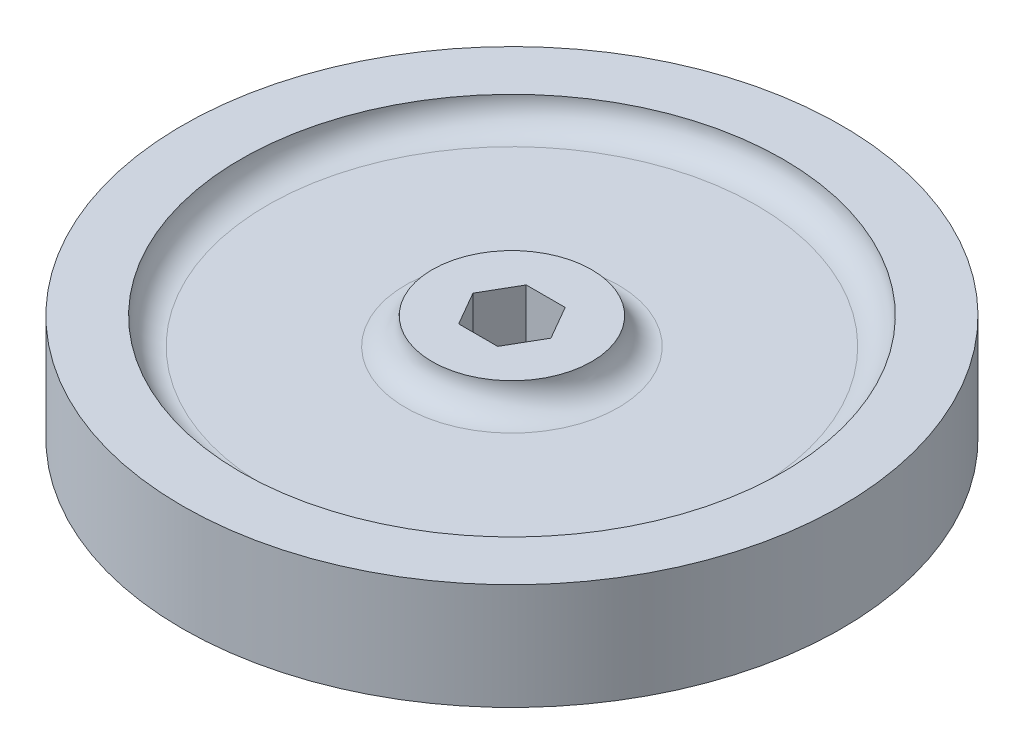
ISO-10303-21;
HEADER;
FILE_DESCRIPTION(('STEP AP214'),'2;1');
FILE_NAME('part.step','',(''),(''),'','','');
FILE_SCHEMA(('AUTOMOTIVE_DESIGN { 1 0 10303 214 1 1 1 1 }'));
ENDSEC;
DATA;
#1=APPLICATION_CONTEXT('core data for automotive mechanical design processes');
#2=APPLICATION_PROTOCOL_DEFINITION('international standard','automotive_design',2000,#1);
#3=PRODUCT_CONTEXT('',#1,'mechanical');
#4=PRODUCT('Part','Part','',(#3));
#5=PRODUCT_RELATED_PRODUCT_CATEGORY('part','',(#4));
#6=PRODUCT_DEFINITION_FORMATION('','',#4);
#7=PRODUCT_DEFINITION_CONTEXT('part definition',#1,'design');
#8=PRODUCT_DEFINITION('design','',#6,#7);
#9=PRODUCT_DEFINITION_SHAPE('','',#8);
#10=(LENGTH_UNIT() NAMED_UNIT(*) SI_UNIT(.MILLI.,.METRE.));
#11=(NAMED_UNIT(*) PLANE_ANGLE_UNIT() SI_UNIT($,.RADIAN.));
#12=(NAMED_UNIT(*) SI_UNIT($,.STERADIAN.) SOLID_ANGLE_UNIT());
#13=UNCERTAINTY_MEASURE_WITH_UNIT(LENGTH_MEASURE(1.E-05),#10,'distance_accuracy_value','');
#14=(GEOMETRIC_REPRESENTATION_CONTEXT(3) GLOBAL_UNCERTAINTY_ASSIGNED_CONTEXT((#13)) GLOBAL_UNIT_ASSIGNED_CONTEXT((#10,
#11,#12)) REPRESENTATION_CONTEXT('',''));
#15=CARTESIAN_POINT('',(0.,0.,0.));
#16=DIRECTION('',(0.,0.,1.));
#17=DIRECTION('',(1.,0.,0.));
#18=AXIS2_PLACEMENT_3D('',#15,#16,#17);
#19=CARTESIAN_POINT('',(0.,20.,0.));
#20=DIRECTION('',(0.,-1.,0.));
#21=DIRECTION('',(0.,0.,1.));
#22=AXIS2_PLACEMENT_3D('',#19,#20,#21);
#23=PLANE('',#22);
#24=DIRECTION('',(1.,0.,0.));
#25=VECTOR('',#24,1.);
#26=CARTESIAN_POINT('',(-3.66617420935411,20.,6.35000000000001));
#27=LINE('',#26,#25);
#28=CARTESIAN_POINT('',(-3.66617420935411,20.,6.35000000000001));
#29=VERTEX_POINT('',#28);
#30=CARTESIAN_POINT('',(3.66617420935416,20.,6.34999999999999));
#31=VERTEX_POINT('',#30);
#32=EDGE_CURVE('E168',#29,#31,#27,.T.);
#33=ORIENTED_EDGE('',*,*,#32,.F.);
#34=DIRECTION('',(0.500000000000001,0.,0.866025403784438));
#35=VECTOR('',#34,1.);
#36=CARTESIAN_POINT('',(-7.33234841870825,20.,0.));
#37=LINE('',#36,#35);
#38=CARTESIAN_POINT('',(-7.33234841870825,20.,0.));
#39=VERTEX_POINT('',#38);
#40=EDGE_CURVE('E152',#39,#29,#37,.T.);
#41=ORIENTED_EDGE('',*,*,#40,.F.);
#42=DIRECTION('',(-0.499999999999995,0.,0.866025403784442));
#43=VECTOR('',#42,1.);
#44=CARTESIAN_POINT('',(-3.6661742093542,20.,-6.34999999999996));
#45=LINE('',#44,#43);
#46=CARTESIAN_POINT('',(-3.6661742093542,20.,-6.34999999999996));
#47=VERTEX_POINT('',#46);
#48=EDGE_CURVE('E159',#47,#39,#45,.T.);
#49=ORIENTED_EDGE('',*,*,#48,.F.);
#50=DIRECTION('',(-1.,0.,0.));
#51=VECTOR('',#50,1.);
#52=CARTESIAN_POINT('',(3.66617420935407,20.,-6.35000000000004));
#53=LINE('',#52,#51);
#54=CARTESIAN_POINT('',(3.66617420935407,20.,-6.35000000000004));
#55=VERTEX_POINT('',#54);
#56=EDGE_CURVE('E163',#55,#47,#53,.T.);
#57=ORIENTED_EDGE('',*,*,#56,.F.);
#58=DIRECTION('',(-0.500000000000007,0.,-0.866025403784434));
#59=VECTOR('',#58,1.);
#60=CARTESIAN_POINT('',(7.33234841870825,20.,0.));
#61=LINE('',#60,#59);
#62=CARTESIAN_POINT('',(7.33234841870825,20.,0.));
#63=VERTEX_POINT('',#62);
#64=EDGE_CURVE('E177',#63,#55,#61,.T.);
#65=ORIENTED_EDGE('',*,*,#64,.F.);
#66=DIRECTION('',(0.499999999999995,0.,-0.866025403784441));
#67=VECTOR('',#66,1.);
#68=CARTESIAN_POINT('',(3.66617420935416,20.,6.34999999999999));
#69=LINE('',#68,#67);
#70=EDGE_CURVE('E180',#31,#63,#69,.T.);
#71=ORIENTED_EDGE('',*,*,#70,.F.);
#72=EDGE_LOOP('',(#33,#41,#49,#57,#65,#71));
#73=FACE_BOUND('',#72,.T.);
#74=CARTESIAN_POINT('',(0.,20.,0.));
#75=DIRECTION('',(0.,1.,0.));
#76=DIRECTION('',(0.,0.,1.));
#77=AXIS2_PLACEMENT_3D('',#74,#75,#76);
#78=CIRCLE('',#77,15.);
#79=CARTESIAN_POINT('',(0.,20.,15.));
#80=VERTEX_POINT('',#79);
#81=EDGE_CURVE('E172',#80,#80,#78,.T.);
#82=ORIENTED_EDGE('',*,*,#81,.T.);
#83=EDGE_LOOP('',(#82));
#84=FACE_BOUND('',#83,.T.);
#85=ADVANCED_FACE('F95',(#73,#84),#23,.F.);
#86=CARTESIAN_POINT('',(0.,0.,0.));
#87=DIRECTION('',(0.,1.,0.));
#88=DIRECTION('',(0.,0.,1.));
#89=AXIS2_PLACEMENT_3D('',#86,#87,#88);
#90=PLANE('',#89);
#91=CARTESIAN_POINT('',(0.,0.,0.));
#92=DIRECTION('',(0.,1.,0.));
#93=DIRECTION('',(0.,0.,1.));
#94=AXIS2_PLACEMENT_3D('',#91,#92,#93);
#95=CIRCLE('',#94,51.);
#96=CARTESIAN_POINT('',(0.,0.,51.));
#97=VERTEX_POINT('',#96);
#98=EDGE_CURVE('E187',#97,#97,#95,.T.);
#99=ORIENTED_EDGE('',*,*,#98,.T.);
#100=EDGE_LOOP('',(#99));
#101=FACE_BOUND('',#100,.T.);
#102=CARTESIAN_POINT('',(0.,0.,0.));
#103=DIRECTION('',(0.,1.,0.));
#104=DIRECTION('',(0.,0.,1.));
#105=AXIS2_PLACEMENT_3D('',#102,#103,#104);
#106=CIRCLE('',#105,62.);
#107=CARTESIAN_POINT('',(0.,0.,62.));
#108=VERTEX_POINT('',#107);
#109=EDGE_CURVE('E262',#108,#108,#106,.T.);
#110=ORIENTED_EDGE('',*,*,#109,.F.);
#111=EDGE_LOOP('',(#110));
#112=FACE_BOUND('',#111,.T.);
#113=ADVANCED_FACE('F235',(#101,#112),#90,.F.);
#114=CARTESIAN_POINT('',(0.,0.,0.));
#115=DIRECTION('',(0.,1.,0.));
#116=DIRECTION('',(0.,0.,1.));
#117=AXIS2_PLACEMENT_3D('',#114,#115,#116);
#118=CIRCLE('',#117,15.);
#119=CARTESIAN_POINT('',(0.,0.,15.));
#120=VERTEX_POINT('',#119);
#121=EDGE_CURVE('E184',#120,#120,#118,.T.);
#122=ORIENTED_EDGE('',*,*,#121,.F.);
#123=EDGE_LOOP('',(#122));
#124=FACE_BOUND('',#123,.T.);
#125=DIRECTION('',(0.500000000000001,0.,0.866025403784438));
#126=VECTOR('',#125,1.);
#127=CARTESIAN_POINT('',(-7.33234841870825,0.,0.));
#128=LINE('',#127,#126);
#129=CARTESIAN_POINT('',(-7.33234841870825,0.,0.));
#130=VERTEX_POINT('',#129);
#131=CARTESIAN_POINT('',(-3.66617420935411,0.,6.35000000000001));
#132=VERTEX_POINT('',#131);
#133=EDGE_CURVE('E110',#130,#132,#128,.T.);
#134=ORIENTED_EDGE('',*,*,#133,.T.);
#135=DIRECTION('',(1.,0.,0.));
#136=VECTOR('',#135,1.);
#137=CARTESIAN_POINT('',(-3.66617420935411,0.,6.35000000000001));
#138=LINE('',#137,#136);
#139=CARTESIAN_POINT('',(3.66617420935416,0.,6.34999999999999));
#140=VERTEX_POINT('',#139);
#141=EDGE_CURVE('E191',#132,#140,#138,.T.);
#142=ORIENTED_EDGE('',*,*,#141,.T.);
#143=DIRECTION('',(0.499999999999995,0.,-0.866025403784441));
#144=VECTOR('',#143,1.);
#145=CARTESIAN_POINT('',(3.66617420935416,0.,6.34999999999999));
#146=LINE('',#145,#144);
#147=CARTESIAN_POINT('',(7.33234841870825,0.,0.));
#148=VERTEX_POINT('',#147);
#149=EDGE_CURVE('E194',#140,#148,#146,.T.);
#150=ORIENTED_EDGE('',*,*,#149,.T.);
#151=DIRECTION('',(-0.500000000000007,0.,-0.866025403784434));
#152=VECTOR('',#151,1.);
#153=CARTESIAN_POINT('',(7.33234841870825,0.,0.));
#154=LINE('',#153,#152);
#155=CARTESIAN_POINT('',(3.66617420935407,0.,-6.35000000000004));
#156=VERTEX_POINT('',#155);
#157=EDGE_CURVE('E197',#148,#156,#154,.T.);
#158=ORIENTED_EDGE('',*,*,#157,.T.);
#159=DIRECTION('',(-1.,0.,0.));
#160=VECTOR('',#159,1.);
#161=CARTESIAN_POINT('',(3.66617420935407,0.,-6.35000000000004));
#162=LINE('',#161,#160);
#163=CARTESIAN_POINT('',(-3.6661742093542,0.,-6.34999999999996));
#164=VERTEX_POINT('',#163);
#165=EDGE_CURVE('E200',#156,#164,#162,.T.);
#166=ORIENTED_EDGE('',*,*,#165,.T.);
#167=DIRECTION('',(-0.499999999999995,0.,0.866025403784442));
#168=VECTOR('',#167,1.);
#169=CARTESIAN_POINT('',(-3.6661742093542,0.,-6.34999999999996));
#170=LINE('',#169,#168);
#171=EDGE_CURVE('E156',#164,#130,#170,.T.);
#172=ORIENTED_EDGE('',*,*,#171,.T.);
#173=EDGE_LOOP('',(#134,#142,#150,#158,#166,#172));
#174=FACE_BOUND('',#173,.T.);
#175=ADVANCED_FACE('F241',(#124,#174),#90,.F.);
#176=CARTESIAN_POINT('',(-7.33234841870825,10.,0.));
#177=DIRECTION('',(0.866025403784438,0.,-0.500000000000001));
#178=DIRECTION('',(-0.500000000000001,0.,-0.866025403784438));
#179=AXIS2_PLACEMENT_3D('',#176,#177,#178);
#180=PLANE('',#179);
#181=ORIENTED_EDGE('',*,*,#133,.F.);
#182=DIRECTION('',(0.,-1.,0.));
#183=VECTOR('',#182,1.);
#184=CARTESIAN_POINT('',(-7.33234841870825,10.,0.));
#185=LINE('',#184,#183);
#186=EDGE_CURVE('E148',#39,#130,#185,.T.);
#187=ORIENTED_EDGE('',*,*,#186,.F.);
#188=ORIENTED_EDGE('',*,*,#40,.T.);
#189=DIRECTION('',(0.,-1.,0.));
#190=VECTOR('',#189,1.);
#191=CARTESIAN_POINT('',(-3.66617420935411,10.,6.35000000000001));
#192=LINE('',#191,#190);
#193=EDGE_CURVE('E211',#29,#132,#192,.T.);
#194=ORIENTED_EDGE('',*,*,#193,.T.);
#195=EDGE_LOOP('',(#181,#187,#188,#194));
#196=FACE_BOUND('',#195,.T.);
#197=ADVANCED_FACE('F150',(#196),#180,.T.);
#198=CARTESIAN_POINT('',(-3.66617420935411,10.,6.35000000000001));
#199=DIRECTION('',(0.,0.,-1.));
#200=DIRECTION('',(-1.,0.,0.));
#201=AXIS2_PLACEMENT_3D('',#198,#199,#200);
#202=PLANE('',#201);
#203=ORIENTED_EDGE('',*,*,#141,.F.);
#204=ORIENTED_EDGE('',*,*,#193,.F.);
#205=ORIENTED_EDGE('',*,*,#32,.T.);
#206=DIRECTION('',(0.,-1.,0.));
#207=VECTOR('',#206,1.);
#208=CARTESIAN_POINT('',(3.66617420935416,10.,6.34999999999999));
#209=LINE('',#208,#207);
#210=EDGE_CURVE('E209',#31,#140,#209,.T.);
#211=ORIENTED_EDGE('',*,*,#210,.T.);
#212=EDGE_LOOP('',(#203,#204,#205,#211));
#213=FACE_BOUND('',#212,.T.);
#214=ADVANCED_FACE('F285',(#213),#202,.T.);
#215=CARTESIAN_POINT('',(3.66617420935416,10.,6.34999999999999));
#216=DIRECTION('',(-0.866025403784442,0.,-0.499999999999995));
#217=DIRECTION('',(-0.499999999999995,0.,0.866025403784442));
#218=AXIS2_PLACEMENT_3D('',#215,#216,#217);
#219=PLANE('',#218);
#220=ORIENTED_EDGE('',*,*,#149,.F.);
#221=ORIENTED_EDGE('',*,*,#210,.F.);
#222=ORIENTED_EDGE('',*,*,#70,.T.);
#223=DIRECTION('',(0.,-1.,0.));
#224=VECTOR('',#223,1.);
#225=CARTESIAN_POINT('',(7.33234841870825,10.,0.));
#226=LINE('',#225,#224);
#227=EDGE_CURVE('E207',#63,#148,#226,.T.);
#228=ORIENTED_EDGE('',*,*,#227,.T.);
#229=EDGE_LOOP('',(#220,#221,#222,#228));
#230=FACE_BOUND('',#229,.T.);
#231=ADVANCED_FACE('F288',(#230),#219,.T.);
#232=CARTESIAN_POINT('',(7.33234841870825,10.,0.));
#233=DIRECTION('',(-0.866025403784435,0.,0.500000000000007));
#234=DIRECTION('',(0.500000000000007,0.,0.866025403784435));
#235=AXIS2_PLACEMENT_3D('',#232,#233,#234);
#236=PLANE('',#235);
#237=ORIENTED_EDGE('',*,*,#157,.F.);
#238=ORIENTED_EDGE('',*,*,#227,.F.);
#239=ORIENTED_EDGE('',*,*,#64,.T.);
#240=DIRECTION('',(0.,-1.,0.));
#241=VECTOR('',#240,1.);
#242=CARTESIAN_POINT('',(3.66617420935407,10.,-6.35000000000004));
#243=LINE('',#242,#241);
#244=EDGE_CURVE('E205',#55,#156,#243,.T.);
#245=ORIENTED_EDGE('',*,*,#244,.T.);
#246=EDGE_LOOP('',(#237,#238,#239,#245));
#247=FACE_BOUND('',#246,.T.);
#248=ADVANCED_FACE('F292',(#247),#236,.T.);
#249=CARTESIAN_POINT('',(3.66617420935407,10.,-6.35000000000004));
#250=DIRECTION('',(0.,0.,1.));
#251=DIRECTION('',(1.,0.,0.));
#252=AXIS2_PLACEMENT_3D('',#249,#250,#251);
#253=PLANE('',#252);
#254=ORIENTED_EDGE('',*,*,#165,.F.);
#255=ORIENTED_EDGE('',*,*,#244,.F.);
#256=ORIENTED_EDGE('',*,*,#56,.T.);
#257=DIRECTION('',(0.,-1.,0.));
#258=VECTOR('',#257,1.);
#259=CARTESIAN_POINT('',(-3.6661742093542,10.,-6.34999999999996));
#260=LINE('',#259,#258);
#261=EDGE_CURVE('E118',#47,#164,#260,.T.);
#262=ORIENTED_EDGE('',*,*,#261,.T.);
#263=EDGE_LOOP('',(#254,#255,#256,#262));
#264=FACE_BOUND('',#263,.T.);
#265=ADVANCED_FACE('F296',(#264),#253,.T.);
#266=CARTESIAN_POINT('',(-3.6661742093542,10.,-6.34999999999996));
#267=DIRECTION('',(0.866025403784442,0.,0.499999999999995));
#268=DIRECTION('',(0.499999999999995,0.,-0.866025403784442));
#269=AXIS2_PLACEMENT_3D('',#266,#267,#268);
#270=PLANE('',#269);
#271=ORIENTED_EDGE('',*,*,#171,.F.);
#272=ORIENTED_EDGE('',*,*,#261,.F.);
#273=ORIENTED_EDGE('',*,*,#48,.T.);
#274=ORIENTED_EDGE('',*,*,#186,.T.);
#275=EDGE_LOOP('',(#271,#272,#273,#274));
#276=FACE_BOUND('',#275,.T.);
#277=ADVANCED_FACE('F160',(#276),#270,.T.);
#278=CARTESIAN_POINT('',(0.,5.,0.));
#279=DIRECTION('',(0.,1.,0.));
#280=DIRECTION('',(0.,0.,1.));
#281=AXIS2_PLACEMENT_3D('',#278,#279,#280);
#282=PLANE('',#281);
#283=CARTESIAN_POINT('',(0.,5.,0.));
#284=DIRECTION('',(0.,1.,0.));
#285=DIRECTION('',(0.,0.,1.));
#286=AXIS2_PLACEMENT_3D('',#283,#284,#285);
#287=CIRCLE('',#286,20.);
#288=CARTESIAN_POINT('',(0.,5.,20.));
#289=VERTEX_POINT('',#288);
#290=EDGE_CURVE('E216',#289,#289,#287,.T.);
#291=ORIENTED_EDGE('',*,*,#290,.T.);
#292=EDGE_LOOP('',(#291));
#293=FACE_BOUND('',#292,.T.);
#294=CARTESIAN_POINT('',(0.,5.,0.));
#295=DIRECTION('',(0.,1.,0.));
#296=DIRECTION('',(0.,0.,1.));
#297=AXIS2_PLACEMENT_3D('',#294,#295,#296);
#298=CIRCLE('',#297,46.);
#299=CARTESIAN_POINT('',(0.,5.,46.));
#300=VERTEX_POINT('',#299);
#301=EDGE_CURVE('E213',#300,#300,#298,.F.);
#302=ORIENTED_EDGE('',*,*,#301,.T.);
#303=EDGE_LOOP('',(#302));
#304=FACE_BOUND('',#303,.T.);
#305=ADVANCED_FACE('F275',(#293,#304),#282,.F.);
#306=CARTESIAN_POINT('',(0.,0.,0.));
#307=DIRECTION('',(0.,1.,0.));
#308=DIRECTION('',(0.,0.,1.));
#309=AXIS2_PLACEMENT_3D('',#306,#307,#308);
#310=TOROIDAL_SURFACE('',#309,20.,5.);
#311=ORIENTED_EDGE('',*,*,#121,.T.);
#312=EDGE_LOOP('',(#311));
#313=FACE_BOUND('',#312,.T.);
#314=ORIENTED_EDGE('',*,*,#290,.F.);
#315=EDGE_LOOP('',(#314));
#316=FACE_BOUND('',#315,.T.);
#317=ADVANCED_FACE('F254',(#313,#316),#310,.F.);
#318=CARTESIAN_POINT('',(0.,0.,0.));
#319=DIRECTION('',(0.,1.,0.));
#320=DIRECTION('',(0.,0.,1.));
#321=AXIS2_PLACEMENT_3D('',#318,#319,#320);
#322=TOROIDAL_SURFACE('',#321,46.,5.);
#323=ORIENTED_EDGE('',*,*,#301,.F.);
#324=EDGE_LOOP('',(#323));
#325=FACE_BOUND('',#324,.T.);
#326=ORIENTED_EDGE('',*,*,#98,.F.);
#327=EDGE_LOOP('',(#326));
#328=FACE_BOUND('',#327,.T.);
#329=ADVANCED_FACE('F247',(#325,#328),#322,.F.);
#330=CARTESIAN_POINT('',(0.,20.,0.));
#331=DIRECTION('',(0.,1.,0.));
#332=DIRECTION('',(0.,0.,1.));
#333=AXIS2_PLACEMENT_3D('',#330,#331,#332);
#334=CIRCLE('',#333,51.);
#335=CARTESIAN_POINT('',(0.,20.,51.));
#336=VERTEX_POINT('',#335);
#337=EDGE_CURVE('E169',#336,#336,#334,.T.);
#338=ORIENTED_EDGE('',*,*,#337,.F.);
#339=EDGE_LOOP('',(#338));
#340=FACE_BOUND('',#339,.T.);
#341=CARTESIAN_POINT('',(0.,20.,0.));
#342=DIRECTION('',(0.,1.,0.));
#343=DIRECTION('',(0.,0.,1.));
#344=AXIS2_PLACEMENT_3D('',#341,#342,#343);
#345=CIRCLE('',#344,62.);
#346=CARTESIAN_POINT('',(0.,20.,62.));
#347=VERTEX_POINT('',#346);
#348=EDGE_CURVE('E261',#347,#347,#345,.T.);
#349=ORIENTED_EDGE('',*,*,#348,.T.);
#350=EDGE_LOOP('',(#349));
#351=FACE_BOUND('',#350,.T.);
#352=ADVANCED_FACE('F237',(#340,#351),#23,.F.);
#353=CARTESIAN_POINT('',(0.,15.,0.));
#354=DIRECTION('',(0.,-1.,0.));
#355=DIRECTION('',(0.,0.,1.));
#356=AXIS2_PLACEMENT_3D('',#353,#354,#355);
#357=PLANE('',#356);
#358=CARTESIAN_POINT('',(0.,15.,0.));
#359=DIRECTION('',(0.,-1.,0.));
#360=DIRECTION('',(0.,0.,-1.));
#361=AXIS2_PLACEMENT_3D('',#358,#359,#360);
#362=CIRCLE('',#361,20.);
#363=CARTESIAN_POINT('',(0.,15.,-20.));
#364=VERTEX_POINT('',#363);
#365=EDGE_CURVE('E12',#364,#364,#362,.T.);
#366=ORIENTED_EDGE('',*,*,#365,.T.);
#367=EDGE_LOOP('',(#366));
#368=FACE_BOUND('',#367,.T.);
#369=CARTESIAN_POINT('',(0.,15.,0.));
#370=DIRECTION('',(0.,-1.,0.));
#371=DIRECTION('',(0.,0.,-1.));
#372=AXIS2_PLACEMENT_3D('',#369,#370,#371);
#373=CIRCLE('',#372,46.);
#374=CARTESIAN_POINT('',(0.,15.,-46.));
#375=VERTEX_POINT('',#374);
#376=EDGE_CURVE('E103',#375,#375,#373,.F.);
#377=ORIENTED_EDGE('',*,*,#376,.T.);
#378=EDGE_LOOP('',(#377));
#379=FACE_BOUND('',#378,.T.);
#380=ADVANCED_FACE('F221',(#368,#379),#357,.F.);
#381=CARTESIAN_POINT('',(0.,20.,0.));
#382=DIRECTION('',(0.,-1.,0.));
#383=DIRECTION('',(0.,0.,-1.));
#384=AXIS2_PLACEMENT_3D('',#381,#382,#383);
#385=TOROIDAL_SURFACE('',#384,20.,5.);
#386=ORIENTED_EDGE('',*,*,#365,.F.);
#387=EDGE_LOOP('',(#386));
#388=FACE_BOUND('',#387,.T.);
#389=ORIENTED_EDGE('',*,*,#81,.F.);
#390=EDGE_LOOP('',(#389));
#391=FACE_BOUND('',#390,.T.);
#392=ADVANCED_FACE('F225',(#388,#391),#385,.F.);
#393=CARTESIAN_POINT('',(0.,20.,0.));
#394=DIRECTION('',(0.,-1.,0.));
#395=DIRECTION('',(0.,0.,-1.));
#396=AXIS2_PLACEMENT_3D('',#393,#394,#395);
#397=TOROIDAL_SURFACE('',#396,46.,5.);
#398=ORIENTED_EDGE('',*,*,#337,.T.);
#399=EDGE_LOOP('',(#398));
#400=FACE_BOUND('',#399,.T.);
#401=ORIENTED_EDGE('',*,*,#376,.F.);
#402=EDGE_LOOP('',(#401));
#403=FACE_BOUND('',#402,.T.);
#404=ADVANCED_FACE('F97',(#400,#403),#397,.F.);
#405=CARTESIAN_POINT('',(0.,20.,0.));
#406=DIRECTION('',(0.,-1.,0.));
#407=DIRECTION('',(0.,0.,-1.));
#408=AXIS2_PLACEMENT_3D('',#405,#406,#407);
#409=CYLINDRICAL_SURFACE('',#408,62.);
#410=ORIENTED_EDGE('',*,*,#348,.F.);
#411=EDGE_LOOP('',(#410));
#412=FACE_BOUND('',#411,.T.);
#413=ORIENTED_EDGE('',*,*,#109,.T.);
#414=EDGE_LOOP('',(#413));
#415=FACE_BOUND('',#414,.T.);
#416=ADVANCED_FACE('F224',(#412,#415),#409,.T.);
#417=CLOSED_SHELL('',(#85,#113,#175,#197,#214,#231,#248,#265,#277,#305,#317,#329,#352,#380,#392,
#404,#416));
#418=MANIFOLD_SOLID_BREP('B2',#417);
#419=ADVANCED_BREP_SHAPE_REPRESENTATION('',(#18,#418),#14);
#420=SHAPE_DEFINITION_REPRESENTATION(#9,#419);
ENDSEC;
END-ISO-10303-21;
